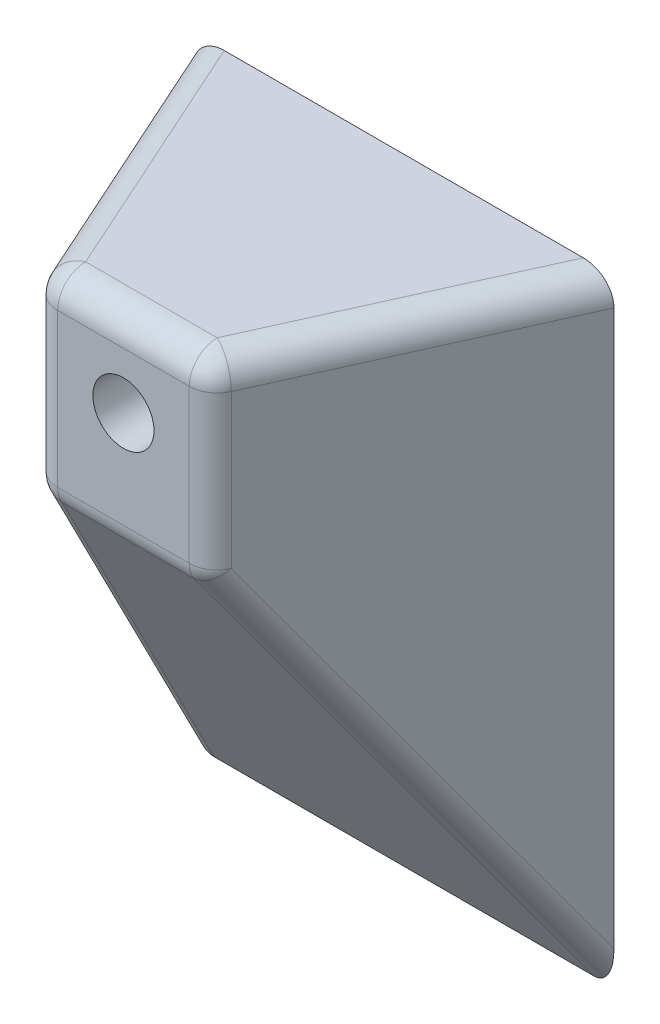
ISO-10303-21;
HEADER;
FILE_DESCRIPTION(('STEP AP214'),'2;1');
FILE_NAME('part.step','',(''),(''),'','','');
FILE_SCHEMA(('AUTOMOTIVE_DESIGN { 1 0 10303 214 1 1 1 1 }'));
ENDSEC;
DATA;
#1=APPLICATION_CONTEXT('core data for automotive mechanical design processes');
#2=APPLICATION_PROTOCOL_DEFINITION('international standard','automotive_design',2000,#1);
#3=PRODUCT_CONTEXT('',#1,'mechanical');
#4=PRODUCT('Part','Part','',(#3));
#5=PRODUCT_RELATED_PRODUCT_CATEGORY('part','',(#4));
#6=PRODUCT_DEFINITION_FORMATION('','',#4);
#7=PRODUCT_DEFINITION_CONTEXT('part definition',#1,'design');
#8=PRODUCT_DEFINITION('design','',#6,#7);
#9=PRODUCT_DEFINITION_SHAPE('','',#8);
#10=(LENGTH_UNIT() NAMED_UNIT(*) SI_UNIT(.MILLI.,.METRE.));
#11=(NAMED_UNIT(*) PLANE_ANGLE_UNIT() SI_UNIT($,.RADIAN.));
#12=(NAMED_UNIT(*) SI_UNIT($,.STERADIAN.) SOLID_ANGLE_UNIT());
#13=UNCERTAINTY_MEASURE_WITH_UNIT(LENGTH_MEASURE(1.E-05),#10,'distance_accuracy_value','');
#14=(GEOMETRIC_REPRESENTATION_CONTEXT(3) GLOBAL_UNCERTAINTY_ASSIGNED_CONTEXT((#13)) GLOBAL_UNIT_ASSIGNED_CONTEXT((#10,
#11,#12)) REPRESENTATION_CONTEXT('',''));
#15=CARTESIAN_POINT('',(0.,0.,0.));
#16=DIRECTION('',(0.,0.,1.));
#17=DIRECTION('',(1.,0.,0.));
#18=AXIS2_PLACEMENT_3D('',#15,#16,#17);
#19=CARTESIAN_POINT('',(0.,0.,0.));
#20=DIRECTION('',(0.,0.,-1.));
#21=DIRECTION('',(-1.,0.,0.));
#22=AXIS2_PLACEMENT_3D('',#19,#20,#21);
#23=PLANE('',#22);
#24=CARTESIAN_POINT('',(75.,-30.,0.));
#25=DIRECTION('',(0.,0.,-1.));
#26=DIRECTION('',(-1.,0.,0.));
#27=AXIS2_PLACEMENT_3D('',#24,#25,#26);
#28=CIRCLE('',#27,10.9);
#29=CARTESIAN_POINT('',(64.1,-30.,0.));
#30=VERTEX_POINT('',#29);
#31=EDGE_CURVE('E336',#30,#30,#28,.T.);
#32=ORIENTED_EDGE('',*,*,#31,.F.);
#33=EDGE_LOOP('',(#32));
#34=FACE_BOUND('',#33,.T.);
#35=DIRECTION('',(-1.,0.,0.));
#36=VECTOR('',#35,1.);
#37=CARTESIAN_POINT('',(0.,0.,0.));
#38=LINE('',#37,#36);
#39=CARTESIAN_POINT('',(139.031250276354,0.,0.));
#40=VERTEX_POINT('',#39);
#41=CARTESIAN_POINT('',(10.9687497236459,0.,0.));
#42=VERTEX_POINT('',#41);
#43=EDGE_CURVE('E54',#40,#42,#38,.T.);
#44=ORIENTED_EDGE('',*,*,#43,.F.);
#45=CARTESIAN_POINT('',(139.031250276354,-10.,0.));
#46=DIRECTION('',(0.,0.,-1.));
#47=DIRECTION('',(1.,0.,0.));
#48=AXIS2_PLACEMENT_3D('',#45,#46,#47);
#49=ELLIPSE('',#48,10.9687497236459,10.);
#50=CARTESIAN_POINT('',(150.,-10.,0.));
#51=VERTEX_POINT('',#50);
#52=EDGE_CURVE('E157',#40,#51,#49,.T.);
#53=ORIENTED_EDGE('',*,*,#52,.T.);
#54=DIRECTION('',(0.,1.,0.));
#55=VECTOR('',#54,1.);
#56=CARTESIAN_POINT('',(150.,0.,0.));
#57=LINE('',#56,#55);
#58=CARTESIAN_POINT('',(150.,-208.037631086903,0.));
#59=VERTEX_POINT('',#58);
#60=EDGE_CURVE('E147',#59,#51,#57,.T.);
#61=ORIENTED_EDGE('',*,*,#60,.F.);
#62=CARTESIAN_POINT('',(139.031250276354,-201.778883591519,0.));
#63=DIRECTION('',(0.,0.,-1.));
#64=DIRECTION('',(0.283735729699374,-0.958902516261149,0.));
#65=AXIS2_PLACEMENT_3D('',#62,#63,#64);
#66=ELLIPSE('',#65,18.770257155175,10.);
#67=CARTESIAN_POINT('',(142.798891803983,-220.,0.));
#68=VERTEX_POINT('',#67);
#69=EDGE_CURVE('E130',#59,#68,#66,.T.);
#70=ORIENTED_EDGE('',*,*,#69,.T.);
#71=DIRECTION('',(1.,0.,0.));
#72=VECTOR('',#71,1.);
#73=CARTESIAN_POINT('',(150.,-220.,0.));
#74=LINE('',#73,#72);
#75=CARTESIAN_POINT('',(7.20110819601666,-220.,0.));
#76=VERTEX_POINT('',#75);
#77=EDGE_CURVE('E159',#76,#68,#74,.T.);
#78=ORIENTED_EDGE('',*,*,#77,.F.);
#79=CARTESIAN_POINT('',(10.9687497236459,-201.778883591519,0.));
#80=DIRECTION('',(0.,0.,-1.));
#81=DIRECTION('',(-0.283735729699374,-0.958902516261149,0.));
#82=AXIS2_PLACEMENT_3D('',#79,#80,#81);
#83=ELLIPSE('',#82,18.770257155175,10.);
#84=CARTESIAN_POINT('',(0.,-208.037631086903,0.));
#85=VERTEX_POINT('',#84);
#86=EDGE_CURVE('E142',#76,#85,#83,.T.);
#87=ORIENTED_EDGE('',*,*,#86,.T.);
#88=DIRECTION('',(0.,-1.,0.));
#89=VECTOR('',#88,1.);
#90=CARTESIAN_POINT('',(0.,-220.,0.));
#91=LINE('',#90,#89);
#92=CARTESIAN_POINT('',(0.,-10.,0.));
#93=VERTEX_POINT('',#92);
#94=EDGE_CURVE('E229',#93,#85,#91,.T.);
#95=ORIENTED_EDGE('',*,*,#94,.F.);
#96=CARTESIAN_POINT('',(10.9687497236459,-10.,0.));
#97=DIRECTION('',(0.,0.,-1.));
#98=DIRECTION('',(-1.,0.,0.));
#99=AXIS2_PLACEMENT_3D('',#96,#97,#98);
#100=ELLIPSE('',#99,10.9687497236459,10.);
#101=EDGE_CURVE('E222',#93,#42,#100,.T.);
#102=ORIENTED_EDGE('',*,*,#101,.T.);
#103=EDGE_LOOP('',(#44,#53,#61,#70,#78,#87,#95,#102));
#104=FACE_BOUND('',#103,.T.);
#105=ADVANCED_FACE('F50',(#34,#104),#23,.T.);
#106=CARTESIAN_POINT('',(0.,0.,100.));
#107=DIRECTION('',(0.,0.,1.));
#108=DIRECTION('',(1.,0.,0.));
#109=AXIS2_PLACEMENT_3D('',#106,#107,#108);
#110=PLANE('',#109);
#111=CARTESIAN_POINT('',(75.,-30.,100.));
#112=DIRECTION('',(0.,0.,1.));
#113=DIRECTION('',(1.,0.,0.));
#114=AXIS2_PLACEMENT_3D('',#111,#112,#113);
#115=CIRCLE('',#114,10.9);
#116=CARTESIAN_POINT('',(85.9,-30.,100.));
#117=VERTEX_POINT('',#116);
#118=EDGE_CURVE('E271',#117,#117,#115,.T.);
#119=ORIENTED_EDGE('',*,*,#118,.F.);
#120=EDGE_LOOP('',(#119));
#121=FACE_BOUND('',#120,.T.);
#122=DIRECTION('',(0.,1.,0.));
#123=VECTOR('',#122,1.);
#124=CARTESIAN_POINT('',(98.4678294332034,0.,100.));
#125=LINE('',#124,#123);
#126=CARTESIAN_POINT('',(98.4678294332034,-64.6922841848493,100.));
#127=VERTEX_POINT('',#126);
#128=CARTESIAN_POINT('',(98.4678294332034,-9.99999999999998,100.));
#129=VERTEX_POINT('',#128);
#130=EDGE_CURVE('E299',#127,#129,#125,.T.);
#131=ORIENTED_EDGE('',*,*,#130,.T.);
#132=DIRECTION('',(-1.,0.,0.));
#133=VECTOR('',#132,1.);
#134=CARTESIAN_POINT('',(0.,-9.99999999999998,100.));
#135=LINE('',#134,#133);
#136=CARTESIAN_POINT('',(51.5321705667966,-9.99999999999998,100.));
#137=VERTEX_POINT('',#136);
#138=EDGE_CURVE('E12',#129,#137,#135,.T.);
#139=ORIENTED_EDGE('',*,*,#138,.T.);
#140=DIRECTION('',(0.,-1.,0.));
#141=VECTOR('',#140,1.);
#142=CARTESIAN_POINT('',(51.5321705667966,0.,100.));
#143=LINE('',#142,#141);
#144=CARTESIAN_POINT('',(51.5321705667966,-64.6922841848493,100.));
#145=VERTEX_POINT('',#144);
#146=EDGE_CURVE('E307',#137,#145,#143,.T.);
#147=ORIENTED_EDGE('',*,*,#146,.T.);
#148=DIRECTION('',(1.,0.,0.));
#149=VECTOR('',#148,1.);
#150=CARTESIAN_POINT('',(0.,-64.6922841848493,100.));
#151=LINE('',#150,#149);
#152=EDGE_CURVE('E304',#145,#127,#151,.T.);
#153=ORIENTED_EDGE('',*,*,#152,.T.);
#154=EDGE_LOOP('',(#131,#139,#147,#153));
#155=FACE_BOUND('',#154,.T.);
#156=ADVANCED_FACE('F182',(#121,#155),#110,.T.);
#157=CARTESIAN_POINT('',(0.,-66.2632473480896,100.93114716214));
#158=DIRECTION('',(0.,-0.548813792515233,0.835944628037675));
#159=DIRECTION('',(0.,-0.835944628037675,-0.548813792515233));
#160=AXIS2_PLACEMENT_3D('',#157,#158,#159);
#161=PLANE('',#160);
#162=ORIENTED_EDGE('',*,*,#77,.T.);
#163=DIRECTION('',(0.240116409865353,-0.811488316467704,-0.532757751656214));
#164=VECTOR('',#163,1.);
#165=CARTESIAN_POINT('',(91.6983291015421,-47.3024754067843,113.379260122147));
#166=LINE('',#165,#164);
#167=CARTESIAN_POINT('',(98.4678294332034,-70.1804221100017,98.3594462803768));
#168=VERTEX_POINT('',#167);
#169=EDGE_CURVE('E135',#68,#168,#166,.F.);
#170=ORIENTED_EDGE('',*,*,#169,.T.);
#171=DIRECTION('',(1.,0.,0.));
#172=VECTOR('',#171,1.);
#173=CARTESIAN_POINT('',(0.,-70.1804221100017,98.3594462803768));
#174=LINE('',#173,#172);
#175=CARTESIAN_POINT('',(51.5321705667966,-70.1804221100017,98.3594462803768));
#176=VERTEX_POINT('',#175);
#177=EDGE_CURVE('E416',#168,#176,#174,.F.);
#178=ORIENTED_EDGE('',*,*,#177,.T.);
#179=DIRECTION('',(-0.240116409865353,-0.811488316467705,-0.532757751656214));
#180=VECTOR('',#179,1.);
#181=CARTESIAN_POINT('',(49.653287355464,-76.53022458647,94.1906783238033));
#182=LINE('',#181,#180);
#183=EDGE_CURVE('E141',#176,#76,#182,.T.);
#184=ORIENTED_EDGE('',*,*,#183,.T.);
#185=EDGE_LOOP('',(#162,#170,#178,#184));
#186=FACE_BOUND('',#185,.T.);
#187=ADVANCED_FACE('F252',(#186),#161,.T.);
#188=CARTESIAN_POINT('',(124.674318990759,0.,56.1912985506151));
#189=DIRECTION('',(0.911680934650417,0.,0.410898860298909));
#190=DIRECTION('',(0.410898860298909,0.,-0.911680934650417));
#191=AXIS2_PLACEMENT_3D('',#188,#189,#190);
#192=PLANE('',#191);
#193=ORIENTED_EDGE('',*,*,#60,.T.);
#194=DIRECTION('',(0.410898860298909,0.,-0.911680934650417));
#195=VECTOR('',#194,1.);
#196=CARTESIAN_POINT('',(124.674318990759,-9.99999999999999,56.1912985506151));
#197=LINE('',#196,#195);
#198=CARTESIAN_POINT('',(107.584638779708,-9.99999999999998,94.1089886029891));
#199=VERTEX_POINT('',#198);
#200=EDGE_CURVE('E423',#51,#199,#197,.F.);
#201=ORIENTED_EDGE('',*,*,#200,.T.);
#202=DIRECTION('',(0.,1.,0.));
#203=VECTOR('',#202,1.);
#204=CARTESIAN_POINT('',(107.584638779708,0.,94.1089886029891));
#205=LINE('',#204,#203);
#206=CARTESIAN_POINT('',(107.584638779708,-64.6922841848493,94.1089886029891));
#207=VERTEX_POINT('',#206);
#208=EDGE_CURVE('E151',#199,#207,#205,.F.);
#209=ORIENTED_EDGE('',*,*,#208,.T.);
#210=DIRECTION('',(0.240116409865353,-0.811488316467705,-0.532757751656214));
#211=VECTOR('',#210,1.);
#212=CARTESIAN_POINT('',(100.815138448046,-41.814337481632,109.12880244476));
#213=LINE('',#212,#211);
#214=EDGE_CURVE('E134',#207,#59,#213,.T.);
#215=ORIENTED_EDGE('',*,*,#214,.T.);
#216=EDGE_LOOP('',(#193,#201,#209,#215));
#217=FACE_BOUND('',#216,.T.);
#218=ADVANCED_FACE('F146',(#217),#192,.T.);
#219=CARTESIAN_POINT('',(0.,0.,0.));
#220=DIRECTION('',(-0.911680934650417,0.,0.410898860298909));
#221=DIRECTION('',(0.410898860298909,0.,0.911680934650417));
#222=AXIS2_PLACEMENT_3D('',#219,#220,#221);
#223=PLANE('',#222);
#224=DIRECTION('',(0.,-1.,0.));
#225=VECTOR('',#224,1.);
#226=CARTESIAN_POINT('',(42.4153612202924,0.,94.1089886029891));
#227=LINE('',#226,#225);
#228=CARTESIAN_POINT('',(42.4153612202924,-64.6922841848493,94.1089886029891));
#229=VERTEX_POINT('',#228);
#230=CARTESIAN_POINT('',(42.4153612202924,-9.99999999999998,94.1089886029891));
#231=VERTEX_POINT('',#230);
#232=EDGE_CURVE('E213',#229,#231,#227,.F.);
#233=ORIENTED_EDGE('',*,*,#232,.T.);
#234=DIRECTION('',(-0.410898860298909,0.,-0.911680934650417));
#235=VECTOR('',#234,1.);
#236=CARTESIAN_POINT('',(0.,-10.,0.));
#237=LINE('',#236,#235);
#238=EDGE_CURVE('E319',#231,#93,#237,.T.);
#239=ORIENTED_EDGE('',*,*,#238,.T.);
#240=ORIENTED_EDGE('',*,*,#94,.T.);
#241=DIRECTION('',(-0.240116409865353,-0.811488316467704,-0.532757751656214));
#242=VECTOR('',#241,1.);
#243=CARTESIAN_POINT('',(40.5364780089598,-71.0420866613177,89.9402206464156));
#244=LINE('',#243,#242);
#245=EDGE_CURVE('E294',#85,#229,#244,.F.);
#246=ORIENTED_EDGE('',*,*,#245,.T.);
#247=EDGE_LOOP('',(#233,#239,#240,#246));
#248=FACE_BOUND('',#247,.T.);
#249=ADVANCED_FACE('F241',(#248),#223,.T.);
#250=CARTESIAN_POINT('',(0.,0.,0.));
#251=DIRECTION('',(0.,1.,0.));
#252=DIRECTION('',(0.,0.,1.));
#253=AXIS2_PLACEMENT_3D('',#250,#251,#252);
#254=PLANE('',#253);
#255=DIRECTION('',(-1.,0.,0.));
#256=VECTOR('',#255,1.);
#257=CARTESIAN_POINT('',(0.,0.,90.));
#258=LINE('',#257,#256);
#259=CARTESIAN_POINT('',(51.5321705667966,0.,90.));
#260=VERTEX_POINT('',#259);
#261=CARTESIAN_POINT('',(98.4678294332034,0.,90.));
#262=VERTEX_POINT('',#261);
#263=EDGE_CURVE('E209',#260,#262,#258,.F.);
#264=ORIENTED_EDGE('',*,*,#263,.T.);
#265=DIRECTION('',(0.410898860298909,0.,-0.911680934650417));
#266=VECTOR('',#265,1.);
#267=CARTESIAN_POINT('',(115.557509644254,0.,52.082309947626));
#268=LINE('',#267,#266);
#269=EDGE_CURVE('E216',#262,#40,#268,.T.);
#270=ORIENTED_EDGE('',*,*,#269,.T.);
#271=ORIENTED_EDGE('',*,*,#43,.T.);
#272=DIRECTION('',(-0.410898860298909,0.,-0.911680934650417));
#273=VECTOR('',#272,1.);
#274=CARTESIAN_POINT('',(9.11680934650417,0.,-4.10898860298909));
#275=LINE('',#274,#273);
#276=EDGE_CURVE('E212',#42,#260,#275,.F.);
#277=ORIENTED_EDGE('',*,*,#276,.T.);
#278=EDGE_LOOP('',(#264,#270,#271,#277));
#279=FACE_BOUND('',#278,.T.);
#280=ADVANCED_FACE('F184',(#279),#254,.T.);
#281=CARTESIAN_POINT('',(75.,-30.,-140.));
#282=DIRECTION('',(0.,0.,1.));
#283=DIRECTION('',(1.,0.,0.));
#284=AXIS2_PLACEMENT_3D('',#281,#282,#283);
#285=CYLINDRICAL_SURFACE('',#284,10.9);
#286=ORIENTED_EDGE('',*,*,#31,.T.);
#287=EDGE_LOOP('',(#286));
#288=FACE_BOUND('',#287,.T.);
#289=ORIENTED_EDGE('',*,*,#118,.T.);
#290=EDGE_LOOP('',(#289));
#291=FACE_BOUND('',#290,.T.);
#292=ADVANCED_FACE('F347',(#288,#291),#285,.F.);
#293=CARTESIAN_POINT('',(49.653287355464,-71.0420866613177,85.8312320434265));
#294=DIRECTION('',(-0.240116409865353,-0.811488316467705,-0.532757751656214));
#295=DIRECTION('',(0.,0.548813792515233,-0.835944628037675));
#296=AXIS2_PLACEMENT_3D('',#293,#294,#295);
#297=CYLINDRICAL_SURFACE('',#296,10.);
#298=ORIENTED_EDGE('',*,*,#86,.F.);
#299=ORIENTED_EDGE('',*,*,#183,.F.);
#300=CARTESIAN_POINT('',(51.5321705667966,-64.6922841848493,90.));
#301=DIRECTION('',(0.240116409865353,0.811488316467704,0.532757751656216));
#302=DIRECTION('',(0.,-0.548813792515234,0.835944628037674));
#303=AXIS2_PLACEMENT_3D('',#300,#301,#302);
#304=CIRCLE('',#303,10.);
#305=EDGE_CURVE('E267',#229,#176,#304,.T.);
#306=ORIENTED_EDGE('',*,*,#305,.F.);
#307=ORIENTED_EDGE('',*,*,#245,.F.);
#308=EDGE_LOOP('',(#298,#299,#306,#307));
#309=FACE_BOUND('',#308,.T.);
#310=ADVANCED_FACE('F386',(#309),#297,.T.);
#311=CARTESIAN_POINT('',(51.5321705667966,0.,90.));
#312=DIRECTION('',(0.,-1.,0.));
#313=DIRECTION('',(0.,0.,-1.));
#314=AXIS2_PLACEMENT_3D('',#311,#312,#313);
#315=CYLINDRICAL_SURFACE('',#314,10.);
#316=ORIENTED_EDGE('',*,*,#146,.F.);
#317=CARTESIAN_POINT('',(51.5321705667966,-9.99999999999998,90.));
#318=DIRECTION('',(0.,-1.,0.));
#319=DIRECTION('',(0.,0.,-1.));
#320=AXIS2_PLACEMENT_3D('',#317,#318,#319);
#321=CIRCLE('',#320,10.);
#322=EDGE_CURVE('E61',#137,#231,#321,.T.);
#323=ORIENTED_EDGE('',*,*,#322,.T.);
#324=ORIENTED_EDGE('',*,*,#232,.F.);
#325=CARTESIAN_POINT('',(51.5321705667966,-64.6922841848493,90.));
#326=DIRECTION('',(0.,-1.,0.));
#327=DIRECTION('',(1.,0.,0.));
#328=AXIS2_PLACEMENT_3D('',#325,#326,#327);
#329=CIRCLE('',#328,10.);
#330=EDGE_CURVE('E272',#145,#229,#329,.T.);
#331=ORIENTED_EDGE('',*,*,#330,.F.);
#332=EDGE_LOOP('',(#316,#323,#324,#331));
#333=FACE_BOUND('',#332,.T.);
#334=ADVANCED_FACE('F389',(#333),#315,.T.);
#335=CARTESIAN_POINT('',(51.5321705667966,-64.6922841848493,90.));
#336=DIRECTION('',(-0.911680934650416,0.,0.41089886029891));
#337=DIRECTION('',(0.41089886029891,0.,0.911680934650417));
#338=AXIS2_PLACEMENT_3D('',#335,#336,#337);
#339=SPHERICAL_SURFACE('',#338,10.);
#340=ORIENTED_EDGE('',*,*,#330,.T.);
#341=ORIENTED_EDGE('',*,*,#305,.T.);
#342=CARTESIAN_POINT('',(51.5321705667966,-64.6922841848493,90.));
#343=DIRECTION('',(-1.,0.,0.));
#344=DIRECTION('',(0.,-1.,0.));
#345=AXIS2_PLACEMENT_3D('',#342,#343,#344);
#346=CIRCLE('',#345,10.);
#347=EDGE_CURVE('E276',#145,#176,#346,.F.);
#348=ORIENTED_EDGE('',*,*,#347,.F.);
#349=EDGE_LOOP('',(#340,#341,#348));
#350=FACE_BOUND('',#349,.T.);
#351=ADVANCED_FACE('F393',(#350),#339,.T.);
#352=CARTESIAN_POINT('',(0.,-64.6922841848493,90.));
#353=DIRECTION('',(1.,0.,0.));
#354=DIRECTION('',(0.,1.,0.));
#355=AXIS2_PLACEMENT_3D('',#352,#353,#354);
#356=CYLINDRICAL_SURFACE('',#355,10.);
#357=ORIENTED_EDGE('',*,*,#347,.T.);
#358=ORIENTED_EDGE('',*,*,#177,.F.);
#359=CARTESIAN_POINT('',(98.4678294332034,-64.6922841848493,90.));
#360=DIRECTION('',(1.,0.,0.));
#361=DIRECTION('',(0.,0.,-1.));
#362=AXIS2_PLACEMENT_3D('',#359,#360,#361);
#363=CIRCLE('',#362,10.);
#364=EDGE_CURVE('E280',#127,#168,#363,.T.);
#365=ORIENTED_EDGE('',*,*,#364,.F.);
#366=ORIENTED_EDGE('',*,*,#152,.F.);
#367=EDGE_LOOP('',(#357,#358,#365,#366));
#368=FACE_BOUND('',#367,.T.);
#369=ADVANCED_FACE('F396',(#368),#356,.T.);
#370=CARTESIAN_POINT('',(98.4678294332034,0.,90.));
#371=DIRECTION('',(0.,1.,0.));
#372=DIRECTION('',(-1.,0.,0.));
#373=AXIS2_PLACEMENT_3D('',#370,#371,#372);
#374=CYLINDRICAL_SURFACE('',#373,10.);
#375=ORIENTED_EDGE('',*,*,#208,.F.);
#376=CARTESIAN_POINT('',(98.4678294332034,-9.99999999999998,90.));
#377=DIRECTION('',(0.,1.,0.));
#378=DIRECTION('',(-1.,0.,0.));
#379=AXIS2_PLACEMENT_3D('',#376,#377,#378);
#380=CIRCLE('',#379,10.);
#381=EDGE_CURVE('E363',#199,#129,#380,.F.);
#382=ORIENTED_EDGE('',*,*,#381,.T.);
#383=ORIENTED_EDGE('',*,*,#130,.F.);
#384=CARTESIAN_POINT('',(98.4678294332034,-64.6922841848493,90.));
#385=DIRECTION('',(0.,-1.,0.));
#386=DIRECTION('',(0.,0.,-1.));
#387=AXIS2_PLACEMENT_3D('',#384,#385,#386);
#388=CIRCLE('',#387,10.);
#389=EDGE_CURVE('E284',#207,#127,#388,.T.);
#390=ORIENTED_EDGE('',*,*,#389,.F.);
#391=EDGE_LOOP('',(#375,#382,#383,#390));
#392=FACE_BOUND('',#391,.T.);
#393=ADVANCED_FACE('F400',(#392),#374,.T.);
#394=CARTESIAN_POINT('',(98.4678294332034,-64.6922841848493,90.));
#395=DIRECTION('',(0.911680934650417,0.,0.410898860298909));
#396=DIRECTION('',(0.410898860298909,0.,-0.911680934650417));
#397=AXIS2_PLACEMENT_3D('',#394,#395,#396);
#398=SPHERICAL_SURFACE('',#397,10.);
#399=ORIENTED_EDGE('',*,*,#389,.T.);
#400=ORIENTED_EDGE('',*,*,#364,.T.);
#401=CARTESIAN_POINT('',(98.4678294332034,-64.6922841848494,90.));
#402=DIRECTION('',(-0.240116409865354,0.811488316467705,0.532757751656214));
#403=DIRECTION('',(0.,-0.548813792515232,0.835944628037676));
#404=AXIS2_PLACEMENT_3D('',#401,#402,#403);
#405=CIRCLE('',#404,10.);
#406=EDGE_CURVE('E288',#207,#168,#405,.F.);
#407=ORIENTED_EDGE('',*,*,#406,.F.);
#408=EDGE_LOOP('',(#399,#400,#407));
#409=FACE_BOUND('',#408,.T.);
#410=ADVANCED_FACE('F403',(#409),#398,.T.);
#411=CARTESIAN_POINT('',(91.6983291015421,-41.814337481632,105.019813841771));
#412=DIRECTION('',(0.240116409865353,-0.811488316467704,-0.532757751656214));
#413=DIRECTION('',(0.,0.548813792515233,-0.835944628037675));
#414=AXIS2_PLACEMENT_3D('',#411,#412,#413);
#415=CYLINDRICAL_SURFACE('',#414,10.);
#416=ORIENTED_EDGE('',*,*,#406,.T.);
#417=ORIENTED_EDGE('',*,*,#169,.F.);
#418=ORIENTED_EDGE('',*,*,#69,.F.);
#419=ORIENTED_EDGE('',*,*,#214,.F.);
#420=EDGE_LOOP('',(#416,#417,#418,#419));
#421=FACE_BOUND('',#420,.T.);
#422=ADVANCED_FACE('F133',(#421),#415,.T.);
#423=CARTESIAN_POINT('',(9.11680934650417,-10.,-4.10898860298909));
#424=DIRECTION('',(-0.410898860298909,0.,-0.911680934650417));
#425=DIRECTION('',(-0.911680934650417,0.,0.410898860298909));
#426=AXIS2_PLACEMENT_3D('',#423,#424,#425);
#427=CYLINDRICAL_SURFACE('',#426,10.);
#428=ORIENTED_EDGE('',*,*,#101,.F.);
#429=ORIENTED_EDGE('',*,*,#238,.F.);
#430=CARTESIAN_POINT('',(51.5321705667966,-9.99999999999998,90.));
#431=DIRECTION('',(0.410898860298908,0.,0.911680934650417));
#432=DIRECTION('',(0.911680934650417,0.,-0.410898860298909));
#433=AXIS2_PLACEMENT_3D('',#430,#431,#432);
#434=CIRCLE('',#433,10.);
#435=EDGE_CURVE('E291',#260,#231,#434,.T.);
#436=ORIENTED_EDGE('',*,*,#435,.F.);
#437=ORIENTED_EDGE('',*,*,#276,.F.);
#438=EDGE_LOOP('',(#428,#429,#436,#437));
#439=FACE_BOUND('',#438,.T.);
#440=ADVANCED_FACE('F52',(#439),#427,.T.);
#441=CARTESIAN_POINT('',(51.5321705667966,-9.99999999999998,90.));
#442=DIRECTION('',(0.,1.,0.));
#443=DIRECTION('',(0.,0.,1.));
#444=AXIS2_PLACEMENT_3D('',#441,#442,#443);
#445=SPHERICAL_SURFACE('',#444,10.);
#446=ORIENTED_EDGE('',*,*,#435,.T.);
#447=ORIENTED_EDGE('',*,*,#322,.F.);
#448=CARTESIAN_POINT('',(51.5321705667966,-9.99999999999998,90.));
#449=DIRECTION('',(1.,0.,0.));
#450=DIRECTION('',(0.,0.,-1.));
#451=AXIS2_PLACEMENT_3D('',#448,#449,#450);
#452=CIRCLE('',#451,10.);
#453=EDGE_CURVE('E329',#260,#137,#452,.T.);
#454=ORIENTED_EDGE('',*,*,#453,.F.);
#455=EDGE_LOOP('',(#446,#447,#454));
#456=FACE_BOUND('',#455,.T.);
#457=ADVANCED_FACE('F374',(#456),#445,.T.);
#458=CARTESIAN_POINT('',(0.,-9.99999999999998,90.));
#459=DIRECTION('',(-1.,0.,0.));
#460=DIRECTION('',(0.,0.,1.));
#461=AXIS2_PLACEMENT_3D('',#458,#459,#460);
#462=CYLINDRICAL_SURFACE('',#461,10.);
#463=ORIENTED_EDGE('',*,*,#453,.T.);
#464=ORIENTED_EDGE('',*,*,#138,.F.);
#465=CARTESIAN_POINT('',(98.4678294332034,-9.99999999999998,90.));
#466=DIRECTION('',(1.,0.,0.));
#467=DIRECTION('',(0.,0.,-1.));
#468=AXIS2_PLACEMENT_3D('',#465,#466,#467);
#469=CIRCLE('',#468,10.);
#470=EDGE_CURVE('E325',#262,#129,#469,.T.);
#471=ORIENTED_EDGE('',*,*,#470,.F.);
#472=ORIENTED_EDGE('',*,*,#263,.F.);
#473=EDGE_LOOP('',(#463,#464,#471,#472));
#474=FACE_BOUND('',#473,.T.);
#475=ADVANCED_FACE('F356',(#474),#462,.T.);
#476=CARTESIAN_POINT('',(98.4678294332034,-9.99999999999998,90.));
#477=DIRECTION('',(0.,1.,0.));
#478=DIRECTION('',(0.,0.,1.));
#479=AXIS2_PLACEMENT_3D('',#476,#477,#478);
#480=SPHERICAL_SURFACE('',#479,10.);
#481=ORIENTED_EDGE('',*,*,#470,.T.);
#482=ORIENTED_EDGE('',*,*,#381,.F.);
#483=CARTESIAN_POINT('',(98.4678294332034,-9.99999999999998,90.));
#484=DIRECTION('',(0.41089886029891,0.,-0.911680934650417));
#485=DIRECTION('',(-0.911680934650417,0.,-0.41089886029891));
#486=AXIS2_PLACEMENT_3D('',#483,#484,#485);
#487=CIRCLE('',#486,10.);
#488=EDGE_CURVE('E321',#262,#199,#487,.T.);
#489=ORIENTED_EDGE('',*,*,#488,.F.);
#490=EDGE_LOOP('',(#481,#482,#489));
#491=FACE_BOUND('',#490,.T.);
#492=ADVANCED_FACE('F362',(#491),#480,.T.);
#493=CARTESIAN_POINT('',(115.557509644254,-9.99999999999999,52.082309947626));
#494=DIRECTION('',(0.410898860298909,0.,-0.911680934650417));
#495=DIRECTION('',(-0.911680934650417,0.,-0.410898860298909));
#496=AXIS2_PLACEMENT_3D('',#493,#494,#495);
#497=CYLINDRICAL_SURFACE('',#496,10.);
#498=ORIENTED_EDGE('',*,*,#488,.T.);
#499=ORIENTED_EDGE('',*,*,#200,.F.);
#500=ORIENTED_EDGE('',*,*,#52,.F.);
#501=ORIENTED_EDGE('',*,*,#269,.F.);
#502=EDGE_LOOP('',(#498,#499,#500,#501));
#503=FACE_BOUND('',#502,.T.);
#504=ADVANCED_FACE('F366',(#503),#497,.T.);
#505=CLOSED_SHELL('',(#105,#156,#187,#218,#249,#280,#292,#310,#334,#351,#369,#393,#410,#422,
#440,#457,#475,#492,#504));
#506=MANIFOLD_SOLID_BREP('B2',#505);
#507=ADVANCED_BREP_SHAPE_REPRESENTATION('',(#18,#506),#14);
#508=SHAPE_DEFINITION_REPRESENTATION(#9,#507);
ENDSEC;
END-ISO-10303-21;
